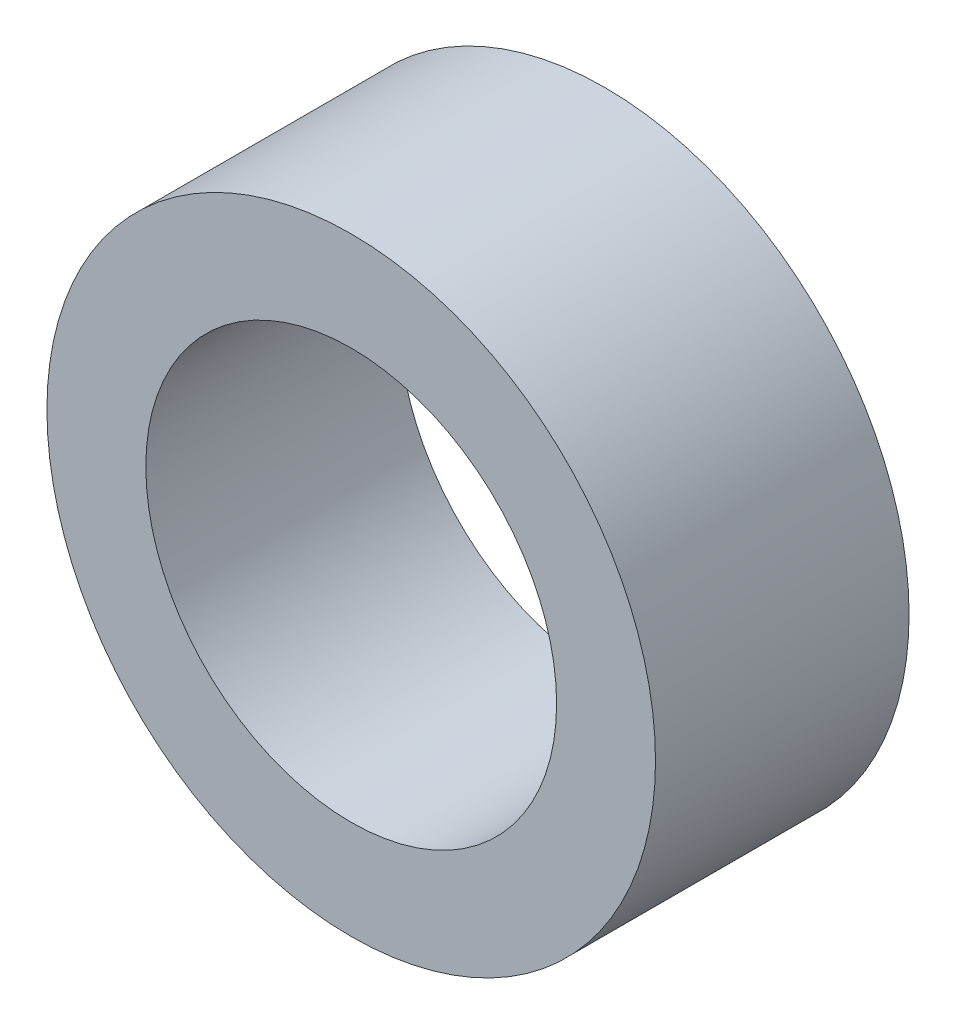
ISO-10303-21;
HEADER;
FILE_DESCRIPTION(('STEP AP214'),'2;1');
FILE_NAME('part.step','',(''),(''),'','','');
FILE_SCHEMA(('AUTOMOTIVE_DESIGN { 1 0 10303 214 1 1 1 1 }'));
ENDSEC;
DATA;
#1=APPLICATION_CONTEXT('core data for automotive mechanical design processes');
#2=APPLICATION_PROTOCOL_DEFINITION('international standard','automotive_design',2000,#1);
#3=PRODUCT_CONTEXT('',#1,'mechanical');
#4=PRODUCT('Part','Part','',(#3));
#5=PRODUCT_RELATED_PRODUCT_CATEGORY('part','',(#4));
#6=PRODUCT_DEFINITION_FORMATION('','',#4);
#7=PRODUCT_DEFINITION_CONTEXT('part definition',#1,'design');
#8=PRODUCT_DEFINITION('design','',#6,#7);
#9=PRODUCT_DEFINITION_SHAPE('','',#8);
#10=(LENGTH_UNIT() NAMED_UNIT(*) SI_UNIT(.MILLI.,.METRE.));
#11=(NAMED_UNIT(*) PLANE_ANGLE_UNIT() SI_UNIT($,.RADIAN.));
#12=(NAMED_UNIT(*) SI_UNIT($,.STERADIAN.) SOLID_ANGLE_UNIT());
#13=UNCERTAINTY_MEASURE_WITH_UNIT(LENGTH_MEASURE(1.E-05),#10,'distance_accuracy_value','');
#14=(GEOMETRIC_REPRESENTATION_CONTEXT(3) GLOBAL_UNCERTAINTY_ASSIGNED_CONTEXT((#13)) GLOBAL_UNIT_ASSIGNED_CONTEXT((#10,
#11,#12)) REPRESENTATION_CONTEXT('',''));
#15=CARTESIAN_POINT('',(0.,0.,0.));
#16=DIRECTION('',(0.,0.,1.));
#17=DIRECTION('',(1.,0.,0.));
#18=AXIS2_PLACEMENT_3D('',#15,#16,#17);
#19=CARTESIAN_POINT('',(0.,0.,5.));
#20=DIRECTION('',(0.,0.,1.));
#21=DIRECTION('',(1.,0.,0.));
#22=AXIS2_PLACEMENT_3D('',#19,#20,#21);
#23=PLANE('',#22);
#24=CARTESIAN_POINT('',(0.,0.,5.));
#25=DIRECTION('',(0.,0.,1.));
#26=DIRECTION('',(1.,0.,0.));
#27=AXIS2_PLACEMENT_3D('',#24,#25,#26);
#28=CIRCLE('',#27,6.);
#29=CARTESIAN_POINT('',(6.,0.,5.));
#30=VERTEX_POINT('',#29);
#31=EDGE_CURVE('E10',#30,#30,#28,.T.);
#32=ORIENTED_EDGE('',*,*,#31,.T.);
#33=EDGE_LOOP('',(#32));
#34=FACE_BOUND('',#33,.T.);
#35=CARTESIAN_POINT('',(0.,0.,5.));
#36=DIRECTION('',(0.,0.,1.));
#37=DIRECTION('',(1.,0.,0.));
#38=AXIS2_PLACEMENT_3D('',#35,#36,#37);
#39=CIRCLE('',#38,4.05);
#40=CARTESIAN_POINT('',(4.05,0.,5.));
#41=VERTEX_POINT('',#40);
#42=EDGE_CURVE('E42',#41,#41,#39,.T.);
#43=ORIENTED_EDGE('',*,*,#42,.F.);
#44=EDGE_LOOP('',(#43));
#45=FACE_BOUND('',#44,.T.);
#46=ADVANCED_FACE('F31',(#34,#45),#23,.T.);
#47=CARTESIAN_POINT('',(0.,0.,0.));
#48=DIRECTION('',(0.,0.,1.));
#49=DIRECTION('',(1.,0.,0.));
#50=AXIS2_PLACEMENT_3D('',#47,#48,#49);
#51=PLANE('',#50);
#52=CARTESIAN_POINT('',(0.,0.,0.));
#53=DIRECTION('',(0.,0.,1.));
#54=DIRECTION('',(1.,0.,0.));
#55=AXIS2_PLACEMENT_3D('',#52,#53,#54);
#56=CIRCLE('',#55,6.);
#57=CARTESIAN_POINT('',(6.,0.,0.));
#58=VERTEX_POINT('',#57);
#59=EDGE_CURVE('E35',#58,#58,#56,.T.);
#60=ORIENTED_EDGE('',*,*,#59,.F.);
#61=EDGE_LOOP('',(#60));
#62=FACE_BOUND('',#61,.T.);
#63=CARTESIAN_POINT('',(0.,0.,0.));
#64=DIRECTION('',(0.,0.,1.));
#65=DIRECTION('',(1.,0.,0.));
#66=AXIS2_PLACEMENT_3D('',#63,#64,#65);
#67=CIRCLE('',#66,4.05);
#68=CARTESIAN_POINT('',(4.05,0.,0.));
#69=VERTEX_POINT('',#68);
#70=EDGE_CURVE('E44',#69,#69,#67,.T.);
#71=ORIENTED_EDGE('',*,*,#70,.T.);
#72=EDGE_LOOP('',(#71));
#73=FACE_BOUND('',#72,.T.);
#74=ADVANCED_FACE('F54',(#62,#73),#51,.F.);
#75=CARTESIAN_POINT('',(0.,0.,5.));
#76=DIRECTION('',(0.,0.,-1.));
#77=DIRECTION('',(-1.,0.,0.));
#78=AXIS2_PLACEMENT_3D('',#75,#76,#77);
#79=CYLINDRICAL_SURFACE('',#78,6.);
#80=ORIENTED_EDGE('',*,*,#31,.F.);
#81=EDGE_LOOP('',(#80));
#82=FACE_BOUND('',#81,.T.);
#83=ORIENTED_EDGE('',*,*,#59,.T.);
#84=EDGE_LOOP('',(#83));
#85=FACE_BOUND('',#84,.T.);
#86=ADVANCED_FACE('F33',(#82,#85),#79,.T.);
#87=CARTESIAN_POINT('',(0.,0.,5.));
#88=DIRECTION('',(0.,0.,-1.));
#89=DIRECTION('',(-1.,0.,0.));
#90=AXIS2_PLACEMENT_3D('',#87,#88,#89);
#91=CYLINDRICAL_SURFACE('',#90,4.05);
#92=ORIENTED_EDGE('',*,*,#42,.T.);
#93=EDGE_LOOP('',(#92));
#94=FACE_BOUND('',#93,.T.);
#95=ORIENTED_EDGE('',*,*,#70,.F.);
#96=EDGE_LOOP('',(#95));
#97=FACE_BOUND('',#96,.T.);
#98=ADVANCED_FACE('F50',(#94,#97),#91,.F.);
#99=CLOSED_SHELL('',(#46,#74,#86,#98));
#100=MANIFOLD_SOLID_BREP('B2',#99);
#101=ADVANCED_BREP_SHAPE_REPRESENTATION('',(#18,#100),#14);
#102=SHAPE_DEFINITION_REPRESENTATION(#9,#101);
ENDSEC;
END-ISO-10303-21;
